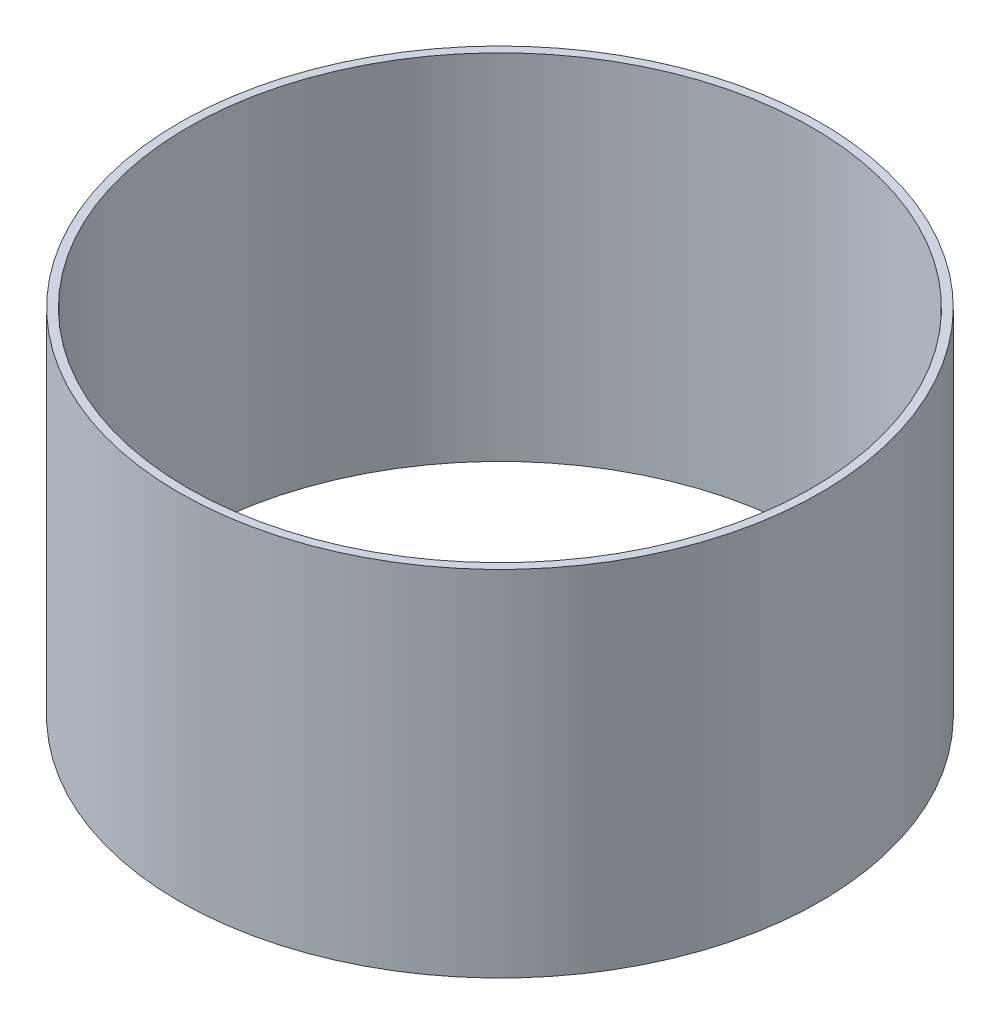
ISO-10303-21;
HEADER;
FILE_DESCRIPTION(('STEP AP214'),'2;1');
FILE_NAME('part.step','',(''),(''),'','','');
FILE_SCHEMA(('AUTOMOTIVE_DESIGN { 1 0 10303 214 1 1 1 1 }'));
ENDSEC;
DATA;
#1=APPLICATION_CONTEXT('core data for automotive mechanical design processes');
#2=APPLICATION_PROTOCOL_DEFINITION('international standard','automotive_design',2000,#1);
#3=PRODUCT_CONTEXT('',#1,'mechanical');
#4=PRODUCT('Part','Part','',(#3));
#5=PRODUCT_RELATED_PRODUCT_CATEGORY('part','',(#4));
#6=PRODUCT_DEFINITION_FORMATION('','',#4);
#7=PRODUCT_DEFINITION_CONTEXT('part definition',#1,'design');
#8=PRODUCT_DEFINITION('design','',#6,#7);
#9=PRODUCT_DEFINITION_SHAPE('','',#8);
#10=(LENGTH_UNIT() NAMED_UNIT(*) SI_UNIT(.MILLI.,.METRE.));
#11=(NAMED_UNIT(*) PLANE_ANGLE_UNIT() SI_UNIT($,.RADIAN.));
#12=(NAMED_UNIT(*) SI_UNIT($,.STERADIAN.) SOLID_ANGLE_UNIT());
#13=UNCERTAINTY_MEASURE_WITH_UNIT(LENGTH_MEASURE(1.E-05),#10,'distance_accuracy_value','');
#14=(GEOMETRIC_REPRESENTATION_CONTEXT(3) GLOBAL_UNCERTAINTY_ASSIGNED_CONTEXT((#13)) GLOBAL_UNIT_ASSIGNED_CONTEXT((#10,
#11,#12)) REPRESENTATION_CONTEXT('',''));
#15=CARTESIAN_POINT('',(0.,0.,0.));
#16=DIRECTION('',(0.,0.,1.));
#17=DIRECTION('',(1.,0.,0.));
#18=AXIS2_PLACEMENT_3D('',#15,#16,#17);
#19=CARTESIAN_POINT('',(0.,42.5,0.));
#20=DIRECTION('',(0.,1.,0.));
#21=DIRECTION('',(0.,0.,1.));
#22=AXIS2_PLACEMENT_3D('',#19,#20,#21);
#23=PLANE('',#22);
#24=CARTESIAN_POINT('',(0.,42.5,0.));
#25=DIRECTION('',(0.,1.,0.));
#26=DIRECTION('',(0.,0.,1.));
#27=AXIS2_PLACEMENT_3D('',#24,#25,#26);
#28=CIRCLE('',#27,38.5);
#29=CARTESIAN_POINT('',(0.,42.5,38.5));
#30=VERTEX_POINT('',#29);
#31=EDGE_CURVE('E10',#30,#30,#28,.T.);
#32=ORIENTED_EDGE('',*,*,#31,.T.);
#33=EDGE_LOOP('',(#32));
#34=FACE_BOUND('',#33,.T.);
#35=CARTESIAN_POINT('',(0.,42.5,0.));
#36=DIRECTION('',(0.,1.,0.));
#37=DIRECTION('',(0.,0.,1.));
#38=AXIS2_PLACEMENT_3D('',#35,#36,#37);
#39=CIRCLE('',#38,37.5);
#40=CARTESIAN_POINT('',(0.,42.5,37.5));
#41=VERTEX_POINT('',#40);
#42=EDGE_CURVE('E50',#41,#41,#39,.T.);
#43=ORIENTED_EDGE('',*,*,#42,.F.);
#44=EDGE_LOOP('',(#43));
#45=FACE_BOUND('',#44,.T.);
#46=ADVANCED_FACE('F37',(#34,#45),#23,.T.);
#47=CARTESIAN_POINT('',(0.,0.,0.));
#48=DIRECTION('',(0.,1.,0.));
#49=DIRECTION('',(0.,0.,1.));
#50=AXIS2_PLACEMENT_3D('',#47,#48,#49);
#51=PLANE('',#50);
#52=CARTESIAN_POINT('',(0.,0.,0.));
#53=DIRECTION('',(0.,1.,0.));
#54=DIRECTION('',(0.,0.,1.));
#55=AXIS2_PLACEMENT_3D('',#52,#53,#54);
#56=CIRCLE('',#55,38.5);
#57=CARTESIAN_POINT('',(0.,0.,38.5));
#58=VERTEX_POINT('',#57);
#59=EDGE_CURVE('E41',#58,#58,#56,.T.);
#60=ORIENTED_EDGE('',*,*,#59,.F.);
#61=EDGE_LOOP('',(#60));
#62=FACE_BOUND('',#61,.T.);
#63=CARTESIAN_POINT('',(0.,0.,0.));
#64=DIRECTION('',(0.,1.,0.));
#65=DIRECTION('',(0.,0.,1.));
#66=AXIS2_PLACEMENT_3D('',#63,#64,#65);
#67=CIRCLE('',#66,37.5);
#68=CARTESIAN_POINT('',(0.,0.,37.5));
#69=VERTEX_POINT('',#68);
#70=EDGE_CURVE('E52',#69,#69,#67,.T.);
#71=ORIENTED_EDGE('',*,*,#70,.T.);
#72=EDGE_LOOP('',(#71));
#73=FACE_BOUND('',#72,.T.);
#74=ADVANCED_FACE('F64',(#62,#73),#51,.F.);
#75=CARTESIAN_POINT('',(0.,42.5,0.));
#76=DIRECTION('',(0.,-1.,0.));
#77=DIRECTION('',(0.,0.,-1.));
#78=AXIS2_PLACEMENT_3D('',#75,#76,#77);
#79=CYLINDRICAL_SURFACE('',#78,38.5);
#80=ORIENTED_EDGE('',*,*,#31,.F.);
#81=EDGE_LOOP('',(#80));
#82=FACE_BOUND('',#81,.T.);
#83=ORIENTED_EDGE('',*,*,#59,.T.);
#84=EDGE_LOOP('',(#83));
#85=FACE_BOUND('',#84,.T.);
#86=ADVANCED_FACE('F39',(#82,#85),#79,.T.);
#87=CARTESIAN_POINT('',(0.,42.5,0.));
#88=DIRECTION('',(0.,-1.,0.));
#89=DIRECTION('',(0.,0.,-1.));
#90=AXIS2_PLACEMENT_3D('',#87,#88,#89);
#91=CYLINDRICAL_SURFACE('',#90,37.5);
#92=ORIENTED_EDGE('',*,*,#42,.T.);
#93=EDGE_LOOP('',(#92));
#94=FACE_BOUND('',#93,.T.);
#95=ORIENTED_EDGE('',*,*,#70,.F.);
#96=EDGE_LOOP('',(#95));
#97=FACE_BOUND('',#96,.T.);
#98=ADVANCED_FACE('F60',(#94,#97),#91,.F.);
#99=CLOSED_SHELL('',(#46,#74,#86,#98));
#100=MANIFOLD_SOLID_BREP('B2',#99);
#101=ADVANCED_BREP_SHAPE_REPRESENTATION('',(#18,#100),#14);
#102=SHAPE_DEFINITION_REPRESENTATION(#9,#101);
ENDSEC;
END-ISO-10303-21;
